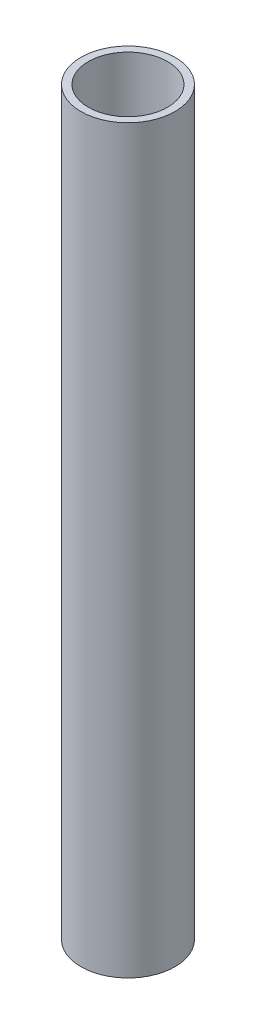
ISO-10303-21;
HEADER;
FILE_DESCRIPTION(('STEP AP214'),'2;1');
FILE_NAME('part.step','',(''),(''),'','','');
FILE_SCHEMA(('AUTOMOTIVE_DESIGN { 1 0 10303 214 1 1 1 1 }'));
ENDSEC;
DATA;
#1=APPLICATION_CONTEXT('core data for automotive mechanical design processes');
#2=APPLICATION_PROTOCOL_DEFINITION('international standard','automotive_design',2000,#1);
#3=PRODUCT_CONTEXT('',#1,'mechanical');
#4=PRODUCT('Part','Part','',(#3));
#5=PRODUCT_RELATED_PRODUCT_CATEGORY('part','',(#4));
#6=PRODUCT_DEFINITION_FORMATION('','',#4);
#7=PRODUCT_DEFINITION_CONTEXT('part definition',#1,'design');
#8=PRODUCT_DEFINITION('design','',#6,#7);
#9=PRODUCT_DEFINITION_SHAPE('','',#8);
#10=(LENGTH_UNIT() NAMED_UNIT(*) SI_UNIT(.MILLI.,.METRE.));
#11=(NAMED_UNIT(*) PLANE_ANGLE_UNIT() SI_UNIT($,.RADIAN.));
#12=(NAMED_UNIT(*) SI_UNIT($,.STERADIAN.) SOLID_ANGLE_UNIT());
#13=UNCERTAINTY_MEASURE_WITH_UNIT(LENGTH_MEASURE(1.E-05),#10,'distance_accuracy_value','');
#14=(GEOMETRIC_REPRESENTATION_CONTEXT(3) GLOBAL_UNCERTAINTY_ASSIGNED_CONTEXT((#13)) GLOBAL_UNIT_ASSIGNED_CONTEXT((#10,
#11,#12)) REPRESENTATION_CONTEXT('',''));
#15=CARTESIAN_POINT('',(0.,0.,0.));
#16=DIRECTION('',(0.,0.,1.));
#17=DIRECTION('',(1.,0.,0.));
#18=AXIS2_PLACEMENT_3D('',#15,#16,#17);
#19=CARTESIAN_POINT('',(0.,200.,0.));
#20=DIRECTION('',(0.,1.,0.));
#21=DIRECTION('',(0.,0.,1.));
#22=AXIS2_PLACEMENT_3D('',#19,#20,#21);
#23=PLANE('',#22);
#24=CARTESIAN_POINT('',(0.,200.,0.));
#25=DIRECTION('',(0.,1.,0.));
#26=DIRECTION('',(0.,0.,1.));
#27=AXIS2_PLACEMENT_3D('',#24,#25,#26);
#28=CIRCLE('',#27,12.7);
#29=CARTESIAN_POINT('',(0.,200.,12.7));
#30=VERTEX_POINT('',#29);
#31=EDGE_CURVE('E10',#30,#30,#28,.T.);
#32=ORIENTED_EDGE('',*,*,#31,.T.);
#33=EDGE_LOOP('',(#32));
#34=FACE_BOUND('',#33,.T.);
#35=CARTESIAN_POINT('',(0.,200.,0.));
#36=DIRECTION('',(0.,1.,0.));
#37=DIRECTION('',(0.,0.,1.));
#38=AXIS2_PLACEMENT_3D('',#35,#36,#37);
#39=CIRCLE('',#38,10.7);
#40=CARTESIAN_POINT('',(0.,200.,10.7));
#41=VERTEX_POINT('',#40);
#42=EDGE_CURVE('E42',#41,#41,#39,.T.);
#43=ORIENTED_EDGE('',*,*,#42,.F.);
#44=EDGE_LOOP('',(#43));
#45=FACE_BOUND('',#44,.T.);
#46=ADVANCED_FACE('F31',(#34,#45),#23,.T.);
#47=CARTESIAN_POINT('',(0.,0.,0.));
#48=DIRECTION('',(0.,1.,0.));
#49=DIRECTION('',(0.,0.,1.));
#50=AXIS2_PLACEMENT_3D('',#47,#48,#49);
#51=PLANE('',#50);
#52=CARTESIAN_POINT('',(0.,0.,0.));
#53=DIRECTION('',(0.,1.,0.));
#54=DIRECTION('',(0.,0.,1.));
#55=AXIS2_PLACEMENT_3D('',#52,#53,#54);
#56=CIRCLE('',#55,12.7);
#57=CARTESIAN_POINT('',(0.,0.,12.7));
#58=VERTEX_POINT('',#57);
#59=EDGE_CURVE('E35',#58,#58,#56,.T.);
#60=ORIENTED_EDGE('',*,*,#59,.F.);
#61=EDGE_LOOP('',(#60));
#62=FACE_BOUND('',#61,.T.);
#63=CARTESIAN_POINT('',(0.,0.,0.));
#64=DIRECTION('',(0.,1.,0.));
#65=DIRECTION('',(0.,0.,1.));
#66=AXIS2_PLACEMENT_3D('',#63,#64,#65);
#67=CIRCLE('',#66,10.7);
#68=CARTESIAN_POINT('',(0.,0.,10.7));
#69=VERTEX_POINT('',#68);
#70=EDGE_CURVE('E44',#69,#69,#67,.T.);
#71=ORIENTED_EDGE('',*,*,#70,.T.);
#72=EDGE_LOOP('',(#71));
#73=FACE_BOUND('',#72,.T.);
#74=ADVANCED_FACE('F54',(#62,#73),#51,.F.);
#75=CARTESIAN_POINT('',(0.,200.,0.));
#76=DIRECTION('',(0.,-1.,0.));
#77=DIRECTION('',(0.,0.,-1.));
#78=AXIS2_PLACEMENT_3D('',#75,#76,#77);
#79=CYLINDRICAL_SURFACE('',#78,12.7);
#80=ORIENTED_EDGE('',*,*,#31,.F.);
#81=EDGE_LOOP('',(#80));
#82=FACE_BOUND('',#81,.T.);
#83=ORIENTED_EDGE('',*,*,#59,.T.);
#84=EDGE_LOOP('',(#83));
#85=FACE_BOUND('',#84,.T.);
#86=ADVANCED_FACE('F33',(#82,#85),#79,.T.);
#87=CARTESIAN_POINT('',(0.,200.,0.));
#88=DIRECTION('',(0.,-1.,0.));
#89=DIRECTION('',(0.,0.,-1.));
#90=AXIS2_PLACEMENT_3D('',#87,#88,#89);
#91=CYLINDRICAL_SURFACE('',#90,10.7);
#92=ORIENTED_EDGE('',*,*,#42,.T.);
#93=EDGE_LOOP('',(#92));
#94=FACE_BOUND('',#93,.T.);
#95=ORIENTED_EDGE('',*,*,#70,.F.);
#96=EDGE_LOOP('',(#95));
#97=FACE_BOUND('',#96,.T.);
#98=ADVANCED_FACE('F50',(#94,#97),#91,.F.);
#99=CLOSED_SHELL('',(#46,#74,#86,#98));
#100=MANIFOLD_SOLID_BREP('B2',#99);
#101=ADVANCED_BREP_SHAPE_REPRESENTATION('',(#18,#100),#14);
#102=SHAPE_DEFINITION_REPRESENTATION(#9,#101);
ENDSEC;
END-ISO-10303-21;
